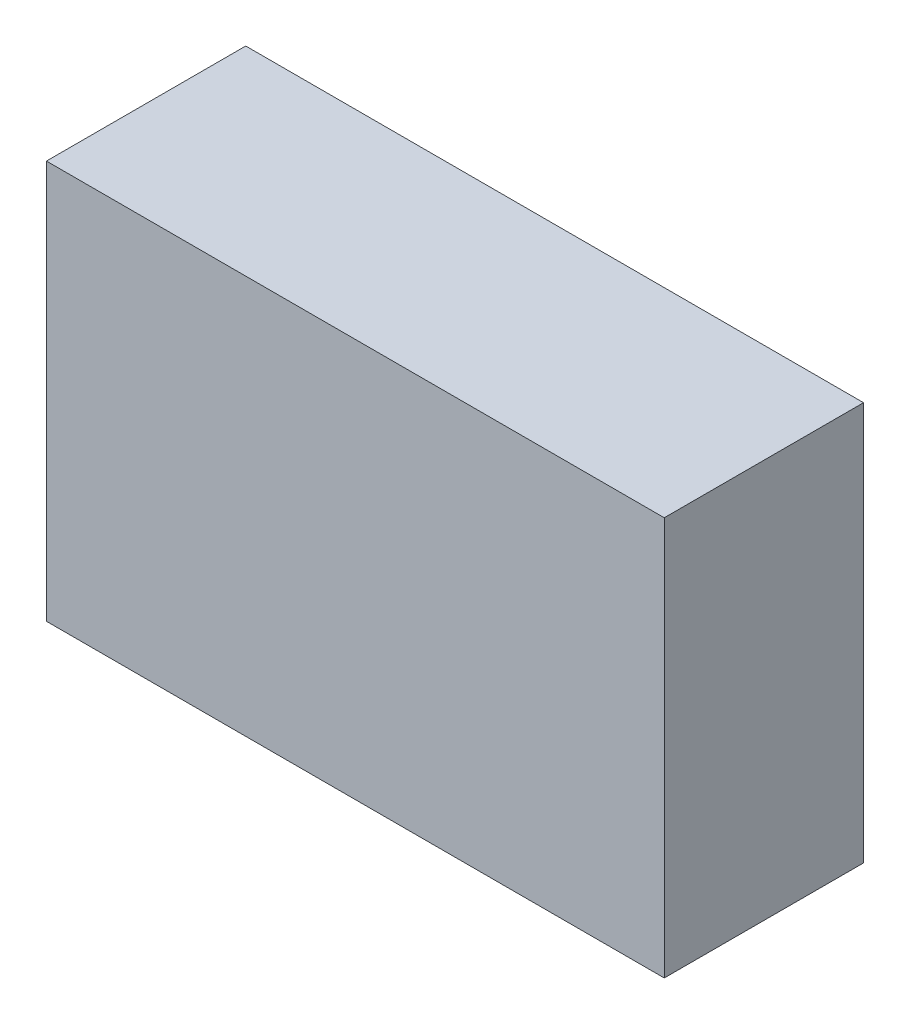
ISO-10303-21;
HEADER;
FILE_DESCRIPTION(('STEP AP214'),'2;1');
FILE_NAME('part.step','',(''),(''),'','','');
FILE_SCHEMA(('AUTOMOTIVE_DESIGN { 1 0 10303 214 1 1 1 1 }'));
ENDSEC;
DATA;
#1=APPLICATION_CONTEXT('core data for automotive mechanical design processes');
#2=APPLICATION_PROTOCOL_DEFINITION('international standard','automotive_design',2000,#1);
#3=PRODUCT_CONTEXT('',#1,'mechanical');
#4=PRODUCT('Part','Part','',(#3));
#5=PRODUCT_RELATED_PRODUCT_CATEGORY('part','',(#4));
#6=PRODUCT_DEFINITION_FORMATION('','',#4);
#7=PRODUCT_DEFINITION_CONTEXT('part definition',#1,'design');
#8=PRODUCT_DEFINITION('design','',#6,#7);
#9=PRODUCT_DEFINITION_SHAPE('','',#8);
#10=(LENGTH_UNIT() NAMED_UNIT(*) SI_UNIT(.MILLI.,.METRE.));
#11=(NAMED_UNIT(*) PLANE_ANGLE_UNIT() SI_UNIT($,.RADIAN.));
#12=(NAMED_UNIT(*) SI_UNIT($,.STERADIAN.) SOLID_ANGLE_UNIT());
#13=UNCERTAINTY_MEASURE_WITH_UNIT(LENGTH_MEASURE(1.E-05),#10,'distance_accuracy_value','');
#14=(GEOMETRIC_REPRESENTATION_CONTEXT(3) GLOBAL_UNCERTAINTY_ASSIGNED_CONTEXT((#13)) GLOBAL_UNIT_ASSIGNED_CONTEXT((#10,
#11,#12)) REPRESENTATION_CONTEXT('',''));
#15=CARTESIAN_POINT('',(0.,0.,0.));
#16=DIRECTION('',(0.,0.,1.));
#17=DIRECTION('',(1.,0.,0.));
#18=AXIS2_PLACEMENT_3D('',#15,#16,#17);
#19=CARTESIAN_POINT('',(0.,0.,-10.));
#20=DIRECTION('',(-1.,0.,0.));
#21=DIRECTION('',(0.,0.,1.));
#22=AXIS2_PLACEMENT_3D('',#19,#20,#21);
#23=PLANE('',#22);
#24=DIRECTION('',(0.,-1.,0.));
#25=VECTOR('',#24,1.);
#26=CARTESIAN_POINT('',(0.,0.,0.));
#27=LINE('',#26,#25);
#28=CARTESIAN_POINT('',(0.,20.,0.));
#29=VERTEX_POINT('',#28);
#30=CARTESIAN_POINT('',(0.,0.,0.));
#31=VERTEX_POINT('',#30);
#32=EDGE_CURVE('E107',#29,#31,#27,.T.);
#33=ORIENTED_EDGE('',*,*,#32,.F.);
#34=DIRECTION('',(0.,0.,1.));
#35=VECTOR('',#34,1.);
#36=CARTESIAN_POINT('',(0.,20.,-10.));
#37=LINE('',#36,#35);
#38=CARTESIAN_POINT('',(0.,20.,-10.));
#39=VERTEX_POINT('',#38);
#40=EDGE_CURVE('E11',#39,#29,#37,.T.);
#41=ORIENTED_EDGE('',*,*,#40,.F.);
#42=DIRECTION('',(0.,-1.,0.));
#43=VECTOR('',#42,1.);
#44=CARTESIAN_POINT('',(0.,0.,-10.));
#45=LINE('',#44,#43);
#46=CARTESIAN_POINT('',(0.,0.,-10.));
#47=VERTEX_POINT('',#46);
#48=EDGE_CURVE('E102',#39,#47,#45,.T.);
#49=ORIENTED_EDGE('',*,*,#48,.T.);
#50=DIRECTION('',(0.,0.,1.));
#51=VECTOR('',#50,1.);
#52=CARTESIAN_POINT('',(0.,0.,-10.));
#53=LINE('',#52,#51);
#54=EDGE_CURVE('E46',#47,#31,#53,.T.);
#55=ORIENTED_EDGE('',*,*,#54,.T.);
#56=EDGE_LOOP('',(#33,#41,#49,#55));
#57=FACE_BOUND('',#56,.T.);
#58=ADVANCED_FACE('F43',(#57),#23,.T.);
#59=CARTESIAN_POINT('',(0.,20.,-10.));
#60=DIRECTION('',(0.,1.,0.));
#61=DIRECTION('',(0.,0.,1.));
#62=AXIS2_PLACEMENT_3D('',#59,#60,#61);
#63=PLANE('',#62);
#64=DIRECTION('',(-1.,0.,0.));
#65=VECTOR('',#64,1.);
#66=CARTESIAN_POINT('',(0.,20.,0.));
#67=LINE('',#66,#65);
#68=CARTESIAN_POINT('',(31.,20.,0.));
#69=VERTEX_POINT('',#68);
#70=EDGE_CURVE('E104',#69,#29,#67,.T.);
#71=ORIENTED_EDGE('',*,*,#70,.F.);
#72=DIRECTION('',(0.,0.,1.));
#73=VECTOR('',#72,1.);
#74=CARTESIAN_POINT('',(31.,20.,-10.));
#75=LINE('',#74,#73);
#76=CARTESIAN_POINT('',(31.,20.,-10.));
#77=VERTEX_POINT('',#76);
#78=EDGE_CURVE('E55',#77,#69,#75,.T.);
#79=ORIENTED_EDGE('',*,*,#78,.F.);
#80=DIRECTION('',(-1.,0.,0.));
#81=VECTOR('',#80,1.);
#82=CARTESIAN_POINT('',(0.,20.,-10.));
#83=LINE('',#82,#81);
#84=EDGE_CURVE('E97',#77,#39,#83,.T.);
#85=ORIENTED_EDGE('',*,*,#84,.T.);
#86=ORIENTED_EDGE('',*,*,#40,.T.);
#87=EDGE_LOOP('',(#71,#79,#85,#86));
#88=FACE_BOUND('',#87,.T.);
#89=ADVANCED_FACE('F117',(#88),#63,.T.);
#90=CARTESIAN_POINT('',(31.,0.,-10.));
#91=DIRECTION('',(1.,0.,0.));
#92=DIRECTION('',(0.,0.,-1.));
#93=AXIS2_PLACEMENT_3D('',#90,#91,#92);
#94=PLANE('',#93);
#95=DIRECTION('',(0.,1.,0.));
#96=VECTOR('',#95,1.);
#97=CARTESIAN_POINT('',(31.,0.,0.));
#98=LINE('',#97,#96);
#99=CARTESIAN_POINT('',(31.,0.,0.));
#100=VERTEX_POINT('',#99);
#101=EDGE_CURVE('E93',#100,#69,#98,.T.);
#102=ORIENTED_EDGE('',*,*,#101,.F.);
#103=DIRECTION('',(0.,0.,1.));
#104=VECTOR('',#103,1.);
#105=CARTESIAN_POINT('',(31.,0.,-10.));
#106=LINE('',#105,#104);
#107=CARTESIAN_POINT('',(31.,0.,-10.));
#108=VERTEX_POINT('',#107);
#109=EDGE_CURVE('E88',#108,#100,#106,.T.);
#110=ORIENTED_EDGE('',*,*,#109,.F.);
#111=DIRECTION('',(0.,1.,0.));
#112=VECTOR('',#111,1.);
#113=CARTESIAN_POINT('',(31.,0.,-10.));
#114=LINE('',#113,#112);
#115=EDGE_CURVE('E91',#108,#77,#114,.T.);
#116=ORIENTED_EDGE('',*,*,#115,.T.);
#117=ORIENTED_EDGE('',*,*,#78,.T.);
#118=EDGE_LOOP('',(#102,#110,#116,#117));
#119=FACE_BOUND('',#118,.T.);
#120=ADVANCED_FACE('F89',(#119),#94,.T.);
#121=CARTESIAN_POINT('',(0.,0.,-10.));
#122=DIRECTION('',(0.,-1.,0.));
#123=DIRECTION('',(0.,0.,-1.));
#124=AXIS2_PLACEMENT_3D('',#121,#122,#123);
#125=PLANE('',#124);
#126=DIRECTION('',(1.,0.,0.));
#127=VECTOR('',#126,1.);
#128=CARTESIAN_POINT('',(0.,0.,0.));
#129=LINE('',#128,#127);
#130=EDGE_CURVE('E110',#31,#100,#129,.T.);
#131=ORIENTED_EDGE('',*,*,#130,.F.);
#132=ORIENTED_EDGE('',*,*,#54,.F.);
#133=DIRECTION('',(1.,0.,0.));
#134=VECTOR('',#133,1.);
#135=CARTESIAN_POINT('',(0.,0.,-10.));
#136=LINE('',#135,#134);
#137=EDGE_CURVE('E100',#47,#108,#136,.T.);
#138=ORIENTED_EDGE('',*,*,#137,.T.);
#139=ORIENTED_EDGE('',*,*,#109,.T.);
#140=EDGE_LOOP('',(#131,#132,#138,#139));
#141=FACE_BOUND('',#140,.T.);
#142=ADVANCED_FACE('F99',(#141),#125,.T.);
#143=CARTESIAN_POINT('',(0.,0.,-10.));
#144=DIRECTION('',(0.,0.,-1.));
#145=DIRECTION('',(-1.,0.,0.));
#146=AXIS2_PLACEMENT_3D('',#143,#144,#145);
#147=PLANE('',#146);
#148=ORIENTED_EDGE('',*,*,#48,.F.);
#149=ORIENTED_EDGE('',*,*,#84,.F.);
#150=ORIENTED_EDGE('',*,*,#115,.F.);
#151=ORIENTED_EDGE('',*,*,#137,.F.);
#152=EDGE_LOOP('',(#148,#149,#150,#151));
#153=FACE_BOUND('',#152,.T.);
#154=ADVANCED_FACE('F96',(#153),#147,.T.);
#155=CARTESIAN_POINT('',(0.,0.,0.));
#156=DIRECTION('',(0.,0.,-1.));
#157=DIRECTION('',(-1.,0.,0.));
#158=AXIS2_PLACEMENT_3D('',#155,#156,#157);
#159=PLANE('',#158);
#160=ORIENTED_EDGE('',*,*,#32,.T.);
#161=ORIENTED_EDGE('',*,*,#130,.T.);
#162=ORIENTED_EDGE('',*,*,#101,.T.);
#163=ORIENTED_EDGE('',*,*,#70,.T.);
#164=EDGE_LOOP('',(#160,#161,#162,#163));
#165=FACE_BOUND('',#164,.T.);
#166=ADVANCED_FACE('F116',(#165),#159,.F.);
#167=CLOSED_SHELL('',(#58,#89,#120,#142,#154,#166));
#168=MANIFOLD_SOLID_BREP('B2',#167);
#169=ADVANCED_BREP_SHAPE_REPRESENTATION('',(#18,#168),#14);
#170=SHAPE_DEFINITION_REPRESENTATION(#9,#169);
ENDSEC;
END-ISO-10303-21;
